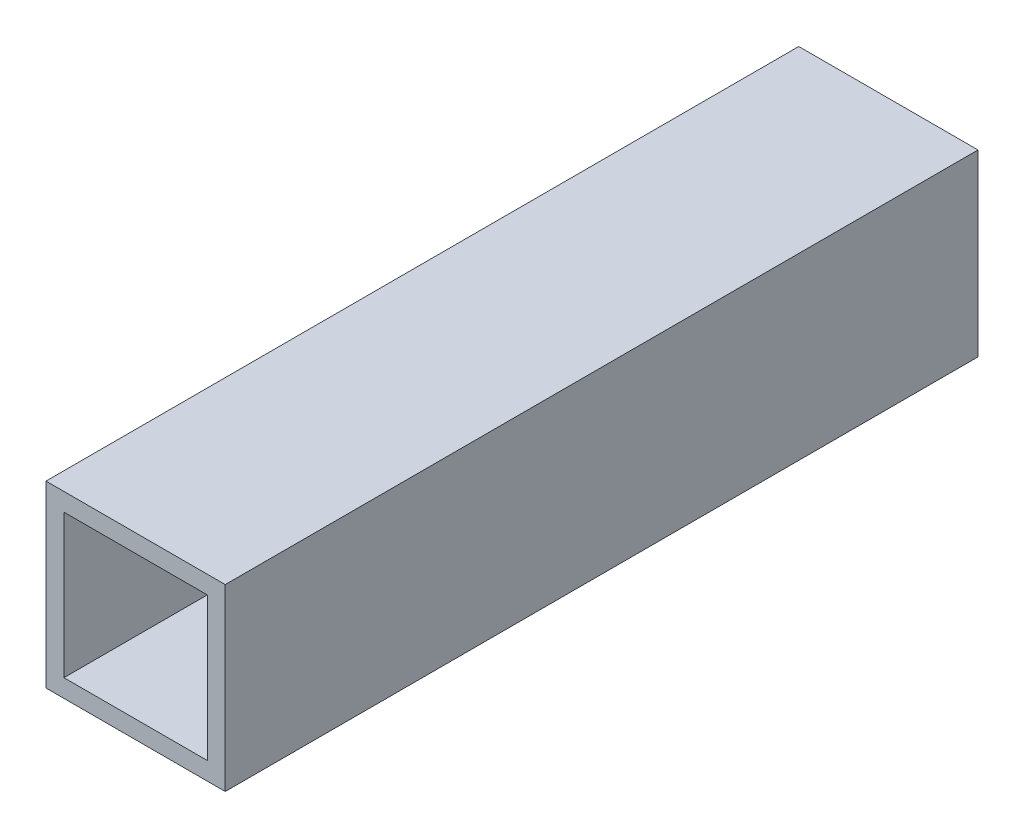
ISO-10303-21;
HEADER;
FILE_DESCRIPTION(('STEP AP214'),'2;1');
FILE_NAME('part.step','',(''),(''),'','','');
FILE_SCHEMA(('AUTOMOTIVE_DESIGN { 1 0 10303 214 1 1 1 1 }'));
ENDSEC;
DATA;
#1=APPLICATION_CONTEXT('core data for automotive mechanical design processes');
#2=APPLICATION_PROTOCOL_DEFINITION('international standard','automotive_design',2000,#1);
#3=PRODUCT_CONTEXT('',#1,'mechanical');
#4=PRODUCT('Part','Part','',(#3));
#5=PRODUCT_RELATED_PRODUCT_CATEGORY('part','',(#4));
#6=PRODUCT_DEFINITION_FORMATION('','',#4);
#7=PRODUCT_DEFINITION_CONTEXT('part definition',#1,'design');
#8=PRODUCT_DEFINITION('design','',#6,#7);
#9=PRODUCT_DEFINITION_SHAPE('','',#8);
#10=(LENGTH_UNIT() NAMED_UNIT(*) SI_UNIT(.MILLI.,.METRE.));
#11=(NAMED_UNIT(*) PLANE_ANGLE_UNIT() SI_UNIT($,.RADIAN.));
#12=(NAMED_UNIT(*) SI_UNIT($,.STERADIAN.) SOLID_ANGLE_UNIT());
#13=UNCERTAINTY_MEASURE_WITH_UNIT(LENGTH_MEASURE(1.E-05),#10,'distance_accuracy_value','');
#14=(GEOMETRIC_REPRESENTATION_CONTEXT(3) GLOBAL_UNCERTAINTY_ASSIGNED_CONTEXT((#13)) GLOBAL_UNIT_ASSIGNED_CONTEXT((#10,
#11,#12)) REPRESENTATION_CONTEXT('',''));
#15=CARTESIAN_POINT('',(0.,0.,0.));
#16=DIRECTION('',(0.,0.,1.));
#17=DIRECTION('',(1.,0.,0.));
#18=AXIS2_PLACEMENT_3D('',#15,#16,#17);
#19=CARTESIAN_POINT('',(0.,0.,84.));
#20=DIRECTION('',(0.,0.,-1.));
#21=DIRECTION('',(-1.,0.,0.));
#22=AXIS2_PLACEMENT_3D('',#19,#20,#21);
#23=PLANE('',#22);
#24=DIRECTION('',(0.,1.,0.));
#25=VECTOR('',#24,1.);
#26=CARTESIAN_POINT('',(10.,-10.,84.));
#27=LINE('',#26,#25);
#28=CARTESIAN_POINT('',(10.,-10.,84.));
#29=VERTEX_POINT('',#28);
#30=CARTESIAN_POINT('',(10.,10.,84.));
#31=VERTEX_POINT('',#30);
#32=EDGE_CURVE('E135',#29,#31,#27,.T.);
#33=ORIENTED_EDGE('',*,*,#32,.T.);
#34=DIRECTION('',(-1.,0.,0.));
#35=VECTOR('',#34,1.);
#36=CARTESIAN_POINT('',(-10.,10.,84.));
#37=LINE('',#36,#35);
#38=CARTESIAN_POINT('',(-10.,10.,84.));
#39=VERTEX_POINT('',#38);
#40=EDGE_CURVE('E138',#31,#39,#37,.T.);
#41=ORIENTED_EDGE('',*,*,#40,.T.);
#42=DIRECTION('',(0.,-1.,0.));
#43=VECTOR('',#42,1.);
#44=CARTESIAN_POINT('',(-10.,-10.,84.));
#45=LINE('',#44,#43);
#46=CARTESIAN_POINT('',(-10.,-10.,84.));
#47=VERTEX_POINT('',#46);
#48=EDGE_CURVE('E141',#39,#47,#45,.T.);
#49=ORIENTED_EDGE('',*,*,#48,.T.);
#50=DIRECTION('',(1.,0.,0.));
#51=VECTOR('',#50,1.);
#52=CARTESIAN_POINT('',(-10.,-10.,84.));
#53=LINE('',#52,#51);
#54=EDGE_CURVE('E143',#47,#29,#53,.T.);
#55=ORIENTED_EDGE('',*,*,#54,.T.);
#56=EDGE_LOOP('',(#33,#41,#49,#55));
#57=FACE_BOUND('',#56,.T.);
#58=DIRECTION('',(0.,1.,0.));
#59=VECTOR('',#58,1.);
#60=CARTESIAN_POINT('',(8.00000000000001,-8.00000000000001,84.));
#61=LINE('',#60,#59);
#62=CARTESIAN_POINT('',(8.00000000000001,-8.00000000000001,84.));
#63=VERTEX_POINT('',#62);
#64=CARTESIAN_POINT('',(8.00000000000001,8.,84.));
#65=VERTEX_POINT('',#64);
#66=EDGE_CURVE('E99',#63,#65,#61,.T.);
#67=ORIENTED_EDGE('',*,*,#66,.F.);
#68=DIRECTION('',(1.,0.,0.));
#69=VECTOR('',#68,1.);
#70=CARTESIAN_POINT('',(-8.,-8.00000000000001,84.));
#71=LINE('',#70,#69);
#72=CARTESIAN_POINT('',(-8.,-8.00000000000001,84.));
#73=VERTEX_POINT('',#72);
#74=EDGE_CURVE('E121',#73,#63,#71,.T.);
#75=ORIENTED_EDGE('',*,*,#74,.F.);
#76=DIRECTION('',(0.,-1.,0.));
#77=VECTOR('',#76,1.);
#78=CARTESIAN_POINT('',(-8.,-8.00000000000001,84.));
#79=LINE('',#78,#77);
#80=CARTESIAN_POINT('',(-8.,8.,84.));
#81=VERTEX_POINT('',#80);
#82=EDGE_CURVE('E119',#81,#73,#79,.T.);
#83=ORIENTED_EDGE('',*,*,#82,.F.);
#84=DIRECTION('',(-1.,0.,0.));
#85=VECTOR('',#84,1.);
#86=CARTESIAN_POINT('',(-8.,8.,84.));
#87=LINE('',#86,#85);
#88=EDGE_CURVE('E107',#65,#81,#87,.T.);
#89=ORIENTED_EDGE('',*,*,#88,.F.);
#90=EDGE_LOOP('',(#67,#75,#83,#89));
#91=FACE_BOUND('',#90,.T.);
#92=ADVANCED_FACE('F34',(#57,#91),#23,.F.);
#93=CARTESIAN_POINT('',(0.,0.,0.));
#94=DIRECTION('',(0.,0.,-1.));
#95=DIRECTION('',(-1.,0.,0.));
#96=AXIS2_PLACEMENT_3D('',#93,#94,#95);
#97=PLANE('',#96);
#98=DIRECTION('',(0.,1.,0.));
#99=VECTOR('',#98,1.);
#100=CARTESIAN_POINT('',(10.,-10.,0.));
#101=LINE('',#100,#99);
#102=CARTESIAN_POINT('',(10.,-10.,0.));
#103=VERTEX_POINT('',#102);
#104=CARTESIAN_POINT('',(10.,10.,0.));
#105=VERTEX_POINT('',#104);
#106=EDGE_CURVE('E115',#103,#105,#101,.T.);
#107=ORIENTED_EDGE('',*,*,#106,.F.);
#108=DIRECTION('',(1.,0.,0.));
#109=VECTOR('',#108,1.);
#110=CARTESIAN_POINT('',(-10.,-10.,0.));
#111=LINE('',#110,#109);
#112=CARTESIAN_POINT('',(-10.,-10.,0.));
#113=VERTEX_POINT('',#112);
#114=EDGE_CURVE('E139',#113,#103,#111,.T.);
#115=ORIENTED_EDGE('',*,*,#114,.F.);
#116=DIRECTION('',(0.,-1.,0.));
#117=VECTOR('',#116,1.);
#118=CARTESIAN_POINT('',(-10.,-10.,0.));
#119=LINE('',#118,#117);
#120=CARTESIAN_POINT('',(-10.,10.,0.));
#121=VERTEX_POINT('',#120);
#122=EDGE_CURVE('E150',#121,#113,#119,.T.);
#123=ORIENTED_EDGE('',*,*,#122,.F.);
#124=DIRECTION('',(-1.,0.,0.));
#125=VECTOR('',#124,1.);
#126=CARTESIAN_POINT('',(-10.,10.,0.));
#127=LINE('',#126,#125);
#128=EDGE_CURVE('E148',#105,#121,#127,.T.);
#129=ORIENTED_EDGE('',*,*,#128,.F.);
#130=EDGE_LOOP('',(#107,#115,#123,#129));
#131=FACE_BOUND('',#130,.T.);
#132=DIRECTION('',(1.,0.,0.));
#133=VECTOR('',#132,1.);
#134=CARTESIAN_POINT('',(-8.,-8.00000000000001,0.));
#135=LINE('',#134,#133);
#136=CARTESIAN_POINT('',(-8.,-8.00000000000001,0.));
#137=VERTEX_POINT('',#136);
#138=CARTESIAN_POINT('',(8.00000000000001,-8.00000000000001,0.));
#139=VERTEX_POINT('',#138);
#140=EDGE_CURVE('E108',#137,#139,#135,.T.);
#141=ORIENTED_EDGE('',*,*,#140,.T.);
#142=DIRECTION('',(0.,1.,0.));
#143=VECTOR('',#142,1.);
#144=CARTESIAN_POINT('',(8.00000000000001,-8.00000000000001,0.));
#145=LINE('',#144,#143);
#146=CARTESIAN_POINT('',(8.00000000000001,8.,0.));
#147=VERTEX_POINT('',#146);
#148=EDGE_CURVE('E57',#139,#147,#145,.T.);
#149=ORIENTED_EDGE('',*,*,#148,.T.);
#150=DIRECTION('',(-1.,0.,0.));
#151=VECTOR('',#150,1.);
#152=CARTESIAN_POINT('',(-8.,8.,0.));
#153=LINE('',#152,#151);
#154=CARTESIAN_POINT('',(-8.,8.,0.));
#155=VERTEX_POINT('',#154);
#156=EDGE_CURVE('E114',#147,#155,#153,.T.);
#157=ORIENTED_EDGE('',*,*,#156,.T.);
#158=DIRECTION('',(0.,-1.,0.));
#159=VECTOR('',#158,1.);
#160=CARTESIAN_POINT('',(-8.,-8.00000000000001,0.));
#161=LINE('',#160,#159);
#162=EDGE_CURVE('E127',#155,#137,#161,.T.);
#163=ORIENTED_EDGE('',*,*,#162,.T.);
#164=EDGE_LOOP('',(#141,#149,#157,#163));
#165=FACE_BOUND('',#164,.T.);
#166=ADVANCED_FACE('F168',(#131,#165),#97,.T.);
#167=CARTESIAN_POINT('',(10.,-10.,84.));
#168=DIRECTION('',(-1.,0.,0.));
#169=DIRECTION('',(0.,0.,1.));
#170=AXIS2_PLACEMENT_3D('',#167,#168,#169);
#171=PLANE('',#170);
#172=ORIENTED_EDGE('',*,*,#106,.T.);
#173=DIRECTION('',(0.,0.,-1.));
#174=VECTOR('',#173,1.);
#175=CARTESIAN_POINT('',(10.,10.,84.));
#176=LINE('',#175,#174);
#177=EDGE_CURVE('E11',#31,#105,#176,.T.);
#178=ORIENTED_EDGE('',*,*,#177,.F.);
#179=ORIENTED_EDGE('',*,*,#32,.F.);
#180=DIRECTION('',(0.,0.,-1.));
#181=VECTOR('',#180,1.);
#182=CARTESIAN_POINT('',(10.,-10.,84.));
#183=LINE('',#182,#181);
#184=EDGE_CURVE('E145',#29,#103,#183,.T.);
#185=ORIENTED_EDGE('',*,*,#184,.T.);
#186=EDGE_LOOP('',(#172,#178,#179,#185));
#187=FACE_BOUND('',#186,.T.);
#188=ADVANCED_FACE('F36',(#187),#171,.F.);
#189=CARTESIAN_POINT('',(-10.,10.,84.));
#190=DIRECTION('',(0.,-1.,0.));
#191=DIRECTION('',(0.,0.,-1.));
#192=AXIS2_PLACEMENT_3D('',#189,#190,#191);
#193=PLANE('',#192);
#194=ORIENTED_EDGE('',*,*,#128,.T.);
#195=DIRECTION('',(0.,0.,-1.));
#196=VECTOR('',#195,1.);
#197=CARTESIAN_POINT('',(-10.,10.,84.));
#198=LINE('',#197,#196);
#199=EDGE_CURVE('E42',#39,#121,#198,.T.);
#200=ORIENTED_EDGE('',*,*,#199,.F.);
#201=ORIENTED_EDGE('',*,*,#40,.F.);
#202=ORIENTED_EDGE('',*,*,#177,.T.);
#203=EDGE_LOOP('',(#194,#200,#201,#202));
#204=FACE_BOUND('',#203,.T.);
#205=ADVANCED_FACE('F178',(#204),#193,.F.);
#206=CARTESIAN_POINT('',(-10.,-10.,84.));
#207=DIRECTION('',(1.,0.,0.));
#208=DIRECTION('',(0.,0.,-1.));
#209=AXIS2_PLACEMENT_3D('',#206,#207,#208);
#210=PLANE('',#209);
#211=ORIENTED_EDGE('',*,*,#122,.T.);
#212=DIRECTION('',(0.,0.,-1.));
#213=VECTOR('',#212,1.);
#214=CARTESIAN_POINT('',(-10.,-10.,84.));
#215=LINE('',#214,#213);
#216=EDGE_CURVE('E155',#47,#113,#215,.T.);
#217=ORIENTED_EDGE('',*,*,#216,.F.);
#218=ORIENTED_EDGE('',*,*,#48,.F.);
#219=ORIENTED_EDGE('',*,*,#199,.T.);
#220=EDGE_LOOP('',(#211,#217,#218,#219));
#221=FACE_BOUND('',#220,.T.);
#222=ADVANCED_FACE('F162',(#221),#210,.F.);
#223=CARTESIAN_POINT('',(-10.,-10.,84.));
#224=DIRECTION('',(0.,1.,0.));
#225=DIRECTION('',(0.,0.,1.));
#226=AXIS2_PLACEMENT_3D('',#223,#224,#225);
#227=PLANE('',#226);
#228=ORIENTED_EDGE('',*,*,#114,.T.);
#229=ORIENTED_EDGE('',*,*,#184,.F.);
#230=ORIENTED_EDGE('',*,*,#54,.F.);
#231=ORIENTED_EDGE('',*,*,#216,.T.);
#232=EDGE_LOOP('',(#228,#229,#230,#231));
#233=FACE_BOUND('',#232,.T.);
#234=ADVANCED_FACE('F172',(#233),#227,.F.);
#235=CARTESIAN_POINT('',(8.00000000000001,-8.00000000000001,84.));
#236=DIRECTION('',(-1.,0.,0.));
#237=DIRECTION('',(0.,0.,1.));
#238=AXIS2_PLACEMENT_3D('',#235,#236,#237);
#239=PLANE('',#238);
#240=ORIENTED_EDGE('',*,*,#148,.F.);
#241=DIRECTION('',(0.,0.,-1.));
#242=VECTOR('',#241,1.);
#243=CARTESIAN_POINT('',(8.00000000000001,-8.00000000000001,84.));
#244=LINE('',#243,#242);
#245=EDGE_CURVE('E103',#63,#139,#244,.T.);
#246=ORIENTED_EDGE('',*,*,#245,.F.);
#247=ORIENTED_EDGE('',*,*,#66,.T.);
#248=DIRECTION('',(0.,0.,-1.));
#249=VECTOR('',#248,1.);
#250=CARTESIAN_POINT('',(8.00000000000001,8.,84.));
#251=LINE('',#250,#249);
#252=EDGE_CURVE('E102',#65,#147,#251,.T.);
#253=ORIENTED_EDGE('',*,*,#252,.T.);
#254=EDGE_LOOP('',(#240,#246,#247,#253));
#255=FACE_BOUND('',#254,.T.);
#256=ADVANCED_FACE('F101',(#255),#239,.T.);
#257=CARTESIAN_POINT('',(-8.,8.,84.));
#258=DIRECTION('',(0.,-1.,0.));
#259=DIRECTION('',(0.,0.,-1.));
#260=AXIS2_PLACEMENT_3D('',#257,#258,#259);
#261=PLANE('',#260);
#262=ORIENTED_EDGE('',*,*,#156,.F.);
#263=ORIENTED_EDGE('',*,*,#252,.F.);
#264=ORIENTED_EDGE('',*,*,#88,.T.);
#265=DIRECTION('',(0.,0.,-1.));
#266=VECTOR('',#265,1.);
#267=CARTESIAN_POINT('',(-8.,8.,84.));
#268=LINE('',#267,#266);
#269=EDGE_CURVE('E116',#81,#155,#268,.T.);
#270=ORIENTED_EDGE('',*,*,#269,.T.);
#271=EDGE_LOOP('',(#262,#263,#264,#270));
#272=FACE_BOUND('',#271,.T.);
#273=ADVANCED_FACE('F111',(#272),#261,.T.);
#274=CARTESIAN_POINT('',(-8.,-8.00000000000001,84.));
#275=DIRECTION('',(1.,0.,0.));
#276=DIRECTION('',(0.,0.,-1.));
#277=AXIS2_PLACEMENT_3D('',#274,#275,#276);
#278=PLANE('',#277);
#279=ORIENTED_EDGE('',*,*,#162,.F.);
#280=ORIENTED_EDGE('',*,*,#269,.F.);
#281=ORIENTED_EDGE('',*,*,#82,.T.);
#282=DIRECTION('',(0.,0.,-1.));
#283=VECTOR('',#282,1.);
#284=CARTESIAN_POINT('',(-8.,-8.00000000000001,84.));
#285=LINE('',#284,#283);
#286=EDGE_CURVE('E49',#73,#137,#285,.T.);
#287=ORIENTED_EDGE('',*,*,#286,.T.);
#288=EDGE_LOOP('',(#279,#280,#281,#287));
#289=FACE_BOUND('',#288,.T.);
#290=ADVANCED_FACE('F201',(#289),#278,.T.);
#291=CARTESIAN_POINT('',(-8.,-8.00000000000001,84.));
#292=DIRECTION('',(0.,1.,0.));
#293=DIRECTION('',(0.,0.,1.));
#294=AXIS2_PLACEMENT_3D('',#291,#292,#293);
#295=PLANE('',#294);
#296=ORIENTED_EDGE('',*,*,#140,.F.);
#297=ORIENTED_EDGE('',*,*,#286,.F.);
#298=ORIENTED_EDGE('',*,*,#74,.T.);
#299=ORIENTED_EDGE('',*,*,#245,.T.);
#300=EDGE_LOOP('',(#296,#297,#298,#299));
#301=FACE_BOUND('',#300,.T.);
#302=ADVANCED_FACE('F205',(#301),#295,.T.);
#303=CLOSED_SHELL('',(#92,#166,#188,#205,#222,#234,#256,#273,#290,#302));
#304=MANIFOLD_SOLID_BREP('B2',#303);
#305=ADVANCED_BREP_SHAPE_REPRESENTATION('',(#18,#304),#14);
#306=SHAPE_DEFINITION_REPRESENTATION(#9,#305);
ENDSEC;
END-ISO-10303-21;
